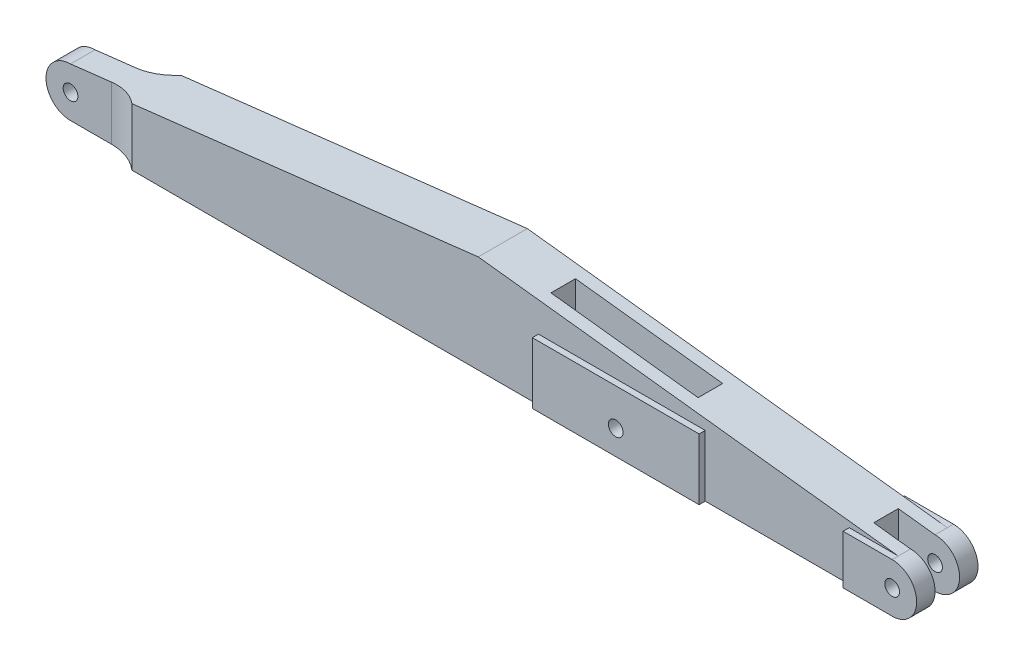
ISO-10303-21;
HEADER;
FILE_DESCRIPTION(('STEP AP214'),'2;1');
FILE_NAME('part.step','',(''),(''),'','','');
FILE_SCHEMA(('AUTOMOTIVE_DESIGN { 1 0 10303 214 1 1 1 1 }'));
ENDSEC;
DATA;
#1=APPLICATION_CONTEXT('core data for automotive mechanical design processes');
#2=APPLICATION_PROTOCOL_DEFINITION('international standard','automotive_design',2000,#1);
#3=PRODUCT_CONTEXT('',#1,'mechanical');
#4=PRODUCT('Part','Part','',(#3));
#5=PRODUCT_RELATED_PRODUCT_CATEGORY('part','',(#4));
#6=PRODUCT_DEFINITION_FORMATION('','',#4);
#7=PRODUCT_DEFINITION_CONTEXT('part definition',#1,'design');
#8=PRODUCT_DEFINITION('design','',#6,#7);
#9=PRODUCT_DEFINITION_SHAPE('','',#8);
#10=(LENGTH_UNIT() NAMED_UNIT(*) SI_UNIT(.MILLI.,.METRE.));
#11=(NAMED_UNIT(*) PLANE_ANGLE_UNIT() SI_UNIT($,.RADIAN.));
#12=(NAMED_UNIT(*) SI_UNIT($,.STERADIAN.) SOLID_ANGLE_UNIT());
#13=UNCERTAINTY_MEASURE_WITH_UNIT(LENGTH_MEASURE(1.E-05),#10,'distance_accuracy_value','');
#14=(GEOMETRIC_REPRESENTATION_CONTEXT(3) GLOBAL_UNCERTAINTY_ASSIGNED_CONTEXT((#13)) GLOBAL_UNIT_ASSIGNED_CONTEXT((#10,
#11,#12)) REPRESENTATION_CONTEXT('',''));
#15=CARTESIAN_POINT('',(0.,0.,0.));
#16=DIRECTION('',(0.,0.,1.));
#17=DIRECTION('',(1.,0.,0.));
#18=AXIS2_PLACEMENT_3D('',#15,#16,#17);
#19=CARTESIAN_POINT('',(114.8954508,0.,10.));
#20=DIRECTION('',(0.,0.,-1.));
#21=DIRECTION('',(-1.,0.,0.));
#22=AXIS2_PLACEMENT_3D('',#19,#20,#21);
#23=CYLINDRICAL_SURFACE('',#22,1.5);
#24=CARTESIAN_POINT('',(114.8954508,0.,2.5));
#25=DIRECTION('',(0.,0.,-1.));
#26=DIRECTION('',(-1.,0.,0.));
#27=AXIS2_PLACEMENT_3D('',#24,#25,#26);
#28=CIRCLE('',#27,1.5);
#29=CARTESIAN_POINT('',(113.3954508,0.,2.5));
#30=VERTEX_POINT('',#29);
#31=EDGE_CURVE('E285',#30,#30,#28,.T.);
#32=ORIENTED_EDGE('',*,*,#31,.F.);
#33=EDGE_LOOP('',(#32));
#34=FACE_BOUND('',#33,.T.);
#35=CARTESIAN_POINT('',(114.8954508,0.,-1.25));
#36=DIRECTION('',(0.,0.,1.));
#37=DIRECTION('',(1.,0.,0.));
#38=AXIS2_PLACEMENT_3D('',#35,#36,#37);
#39=CIRCLE('',#38,1.5);
#40=CARTESIAN_POINT('',(116.3954508,0.,-1.25));
#41=VERTEX_POINT('',#40);
#42=EDGE_CURVE('E437',#41,#41,#39,.T.);
#43=ORIENTED_EDGE('',*,*,#42,.F.);
#44=EDGE_LOOP('',(#43));
#45=FACE_BOUND('',#44,.T.);
#46=ADVANCED_FACE('F37',(#34,#45),#23,.F.);
#47=CARTESIAN_POINT('',(171.25,0.,10.));
#48=DIRECTION('',(0.,0.,-1.));
#49=DIRECTION('',(-1.,0.,0.));
#50=AXIS2_PLACEMENT_3D('',#47,#48,#49);
#51=CYLINDRICAL_SURFACE('',#50,5.);
#52=DIRECTION('',(0.,0.,-1.));
#53=VECTOR('',#52,1.);
#54=CARTESIAN_POINT('',(171.25,5.,10.));
#55=LINE('',#54,#53);
#56=CARTESIAN_POINT('',(171.25,5.,2.5));
#57=VERTEX_POINT('',#56);
#58=CARTESIAN_POINT('',(171.25,5.,0.));
#59=VERTEX_POINT('',#58);
#60=EDGE_CURVE('E337',#57,#59,#55,.T.);
#61=ORIENTED_EDGE('',*,*,#60,.F.);
#62=CARTESIAN_POINT('',(171.25,0.,2.5));
#63=DIRECTION('',(0.,0.,-1.));
#64=DIRECTION('',(-1.,0.,0.));
#65=AXIS2_PLACEMENT_3D('',#62,#63,#64);
#66=CIRCLE('',#65,5.);
#67=CARTESIAN_POINT('',(171.25,-5.,2.5));
#68=VERTEX_POINT('',#67);
#69=EDGE_CURVE('E435',#57,#68,#66,.T.);
#70=ORIENTED_EDGE('',*,*,#69,.T.);
#71=DIRECTION('',(0.,0.,-1.));
#72=VECTOR('',#71,1.);
#73=CARTESIAN_POINT('',(171.25,-5.,10.));
#74=LINE('',#73,#72);
#75=CARTESIAN_POINT('',(171.25,-5.,-1.25));
#76=VERTEX_POINT('',#75);
#77=EDGE_CURVE('E263',#68,#76,#74,.T.);
#78=ORIENTED_EDGE('',*,*,#77,.T.);
#79=CARTESIAN_POINT('',(171.25,0.,-1.25));
#80=DIRECTION('',(0.,0.,1.));
#81=DIRECTION('',(1.,0.,0.));
#82=AXIS2_PLACEMENT_3D('',#79,#80,#81);
#83=CIRCLE('',#82,5.);
#84=CARTESIAN_POINT('',(171.25,5.,-1.25));
#85=VERTEX_POINT('',#84);
#86=EDGE_CURVE('E369',#76,#85,#83,.T.);
#87=ORIENTED_EDGE('',*,*,#86,.T.);
#88=DIRECTION('',(0.,0.,-1.));
#89=VECTOR('',#88,1.);
#90=CARTESIAN_POINT('',(171.25,5.,11.25));
#91=LINE('',#90,#89);
#92=EDGE_CURVE('E359',#59,#85,#91,.T.);
#93=ORIENTED_EDGE('',*,*,#92,.F.);
#94=EDGE_LOOP('',(#61,#70,#78,#87,#93));
#95=FACE_BOUND('',#94,.T.);
#96=ADVANCED_FACE('F367',(#95),#51,.T.);
#97=CARTESIAN_POINT('',(171.25,0.,10.));
#98=DIRECTION('',(0.,0.,-1.));
#99=DIRECTION('',(-1.,0.,0.));
#100=AXIS2_PLACEMENT_3D('',#97,#98,#99);
#101=CYLINDRICAL_SURFACE('',#100,1.5);
#102=CARTESIAN_POINT('',(171.25,0.,2.5));
#103=DIRECTION('',(0.,0.,-1.));
#104=DIRECTION('',(-1.,0.,0.));
#105=AXIS2_PLACEMENT_3D('',#102,#103,#104);
#106=CIRCLE('',#105,1.5);
#107=CARTESIAN_POINT('',(169.75,0.,2.5));
#108=VERTEX_POINT('',#107);
#109=EDGE_CURVE('E272',#108,#108,#106,.T.);
#110=ORIENTED_EDGE('',*,*,#109,.F.);
#111=EDGE_LOOP('',(#110));
#112=FACE_BOUND('',#111,.T.);
#113=CARTESIAN_POINT('',(171.25,0.,-1.25));
#114=DIRECTION('',(0.,0.,1.));
#115=DIRECTION('',(1.,0.,0.));
#116=AXIS2_PLACEMENT_3D('',#113,#114,#115);
#117=CIRCLE('',#116,1.5);
#118=CARTESIAN_POINT('',(172.75,0.,-1.25));
#119=VERTEX_POINT('',#118);
#120=EDGE_CURVE('E491',#119,#119,#117,.T.);
#121=ORIENTED_EDGE('',*,*,#120,.F.);
#122=EDGE_LOOP('',(#121));
#123=FACE_BOUND('',#122,.T.);
#124=ADVANCED_FACE('F535',(#112,#123),#101,.F.);
#125=CARTESIAN_POINT('',(0.,0.,10.));
#126=DIRECTION('',(0.,0.,1.));
#127=DIRECTION('',(1.,0.,0.));
#128=AXIS2_PLACEMENT_3D('',#125,#126,#127);
#129=PLANE('',#128);
#130=DIRECTION('',(0.,1.,0.));
#131=VECTOR('',#130,1.);
#132=CARTESIAN_POINT('',(15.,0.,10.));
#133=LINE('',#132,#131);
#134=CARTESIAN_POINT('',(15.,-5.,10.));
#135=VERTEX_POINT('',#134);
#136=CARTESIAN_POINT('',(15.,6.75182481751825,10.));
#137=VERTEX_POINT('',#136);
#138=EDGE_CURVE('E389',#135,#137,#133,.T.);
#139=ORIENTED_EDGE('',*,*,#138,.F.);
#140=DIRECTION('',(1.,0.,0.));
#141=VECTOR('',#140,1.);
#142=CARTESIAN_POINT('',(0.,-5.,10.));
#143=LINE('',#142,#141);
#144=CARTESIAN_POINT('',(97.8954508,-5.,10.));
#145=VERTEX_POINT('',#144);
#146=EDGE_CURVE('E381',#135,#145,#143,.T.);
#147=ORIENTED_EDGE('',*,*,#146,.T.);
#148=DIRECTION('',(0.,1.,0.));
#149=VECTOR('',#148,1.);
#150=CARTESIAN_POINT('',(97.8954508,0.,10.));
#151=LINE('',#150,#149);
#152=CARTESIAN_POINT('',(97.8954508,7.5,10.));
#153=VERTEX_POINT('',#152);
#154=EDGE_CURVE('E481',#145,#153,#151,.T.);
#155=ORIENTED_EDGE('',*,*,#154,.T.);
#156=DIRECTION('',(1.,0.,0.));
#157=VECTOR('',#156,1.);
#158=CARTESIAN_POINT('',(0.,7.5,10.));
#159=LINE('',#158,#157);
#160=CARTESIAN_POINT('',(131.8954508,7.5,10.));
#161=VERTEX_POINT('',#160);
#162=EDGE_CURVE('E489',#153,#161,#159,.T.);
#163=ORIENTED_EDGE('',*,*,#162,.T.);
#164=DIRECTION('',(0.,-1.,0.));
#165=VECTOR('',#164,1.);
#166=CARTESIAN_POINT('',(131.8954508,0.,10.));
#167=LINE('',#166,#165);
#168=CARTESIAN_POINT('',(131.8954508,-5.,10.));
#169=VERTEX_POINT('',#168);
#170=EDGE_CURVE('E486',#161,#169,#167,.T.);
#171=ORIENTED_EDGE('',*,*,#170,.T.);
#172=CARTESIAN_POINT('',(161.25,-5.,10.));
#173=VERTEX_POINT('',#172);
#174=EDGE_CURVE('E334',#169,#173,#143,.T.);
#175=ORIENTED_EDGE('',*,*,#174,.T.);
#176=DIRECTION('',(0.,1.,0.));
#177=VECTOR('',#176,1.);
#178=CARTESIAN_POINT('',(161.25,0.,10.));
#179=LINE('',#178,#177);
#180=CARTESIAN_POINT('',(161.25,5.,10.));
#181=VERTEX_POINT('',#180);
#182=EDGE_CURVE('E328',#173,#181,#179,.T.);
#183=ORIENTED_EDGE('',*,*,#182,.T.);
#184=DIRECTION('',(1.,0.,0.));
#185=VECTOR('',#184,1.);
#186=CARTESIAN_POINT('',(0.,5.00000000000002,10.));
#187=LINE('',#186,#185);
#188=CARTESIAN_POINT('',(171.25,5.,10.));
#189=VERTEX_POINT('',#188);
#190=EDGE_CURVE('E363',#181,#189,#187,.T.);
#191=ORIENTED_EDGE('',*,*,#190,.T.);
#192=DIRECTION('',(-0.993249224024347,0.115999909375106,0.));
#193=VECTOR('',#192,1.);
#194=CARTESIAN_POINT('',(85.625,15.,10.));
#195=LINE('',#194,#193);
#196=CARTESIAN_POINT('',(85.625,15.,10.));
#197=VERTEX_POINT('',#196);
#198=EDGE_CURVE('E382',#189,#197,#195,.T.);
#199=ORIENTED_EDGE('',*,*,#198,.T.);
#200=DIRECTION('',(-0.993249224024347,-0.115999909375106,0.));
#201=VECTOR('',#200,1.);
#202=CARTESIAN_POINT('',(0.,5.,10.));
#203=LINE('',#202,#201);
#204=EDGE_CURVE('E330',#197,#137,#203,.T.);
#205=ORIENTED_EDGE('',*,*,#204,.T.);
#206=EDGE_LOOP('',(#139,#147,#155,#163,#171,#175,#183,#191,#199,#205));
#207=FACE_BOUND('',#206,.T.);
#208=ADVANCED_FACE('F388',(#207),#129,.T.);
#209=CARTESIAN_POINT('',(0.,0.,0.));
#210=DIRECTION('',(0.,0.,1.));
#211=DIRECTION('',(1.,0.,0.));
#212=AXIS2_PLACEMENT_3D('',#209,#210,#211);
#213=PLANE('',#212);
#214=DIRECTION('',(1.,0.,0.));
#215=VECTOR('',#214,1.);
#216=CARTESIAN_POINT('',(0.,-5.,0.));
#217=LINE('',#216,#215);
#218=CARTESIAN_POINT('',(15.,-5.,0.));
#219=VERTEX_POINT('',#218);
#220=CARTESIAN_POINT('',(97.8954508,-5.,0.));
#221=VERTEX_POINT('',#220);
#222=EDGE_CURVE('E317',#219,#221,#217,.T.);
#223=ORIENTED_EDGE('',*,*,#222,.F.);
#224=DIRECTION('',(0.,1.,0.));
#225=VECTOR('',#224,1.);
#226=CARTESIAN_POINT('',(15.,0.,0.));
#227=LINE('',#226,#225);
#228=CARTESIAN_POINT('',(15.,6.75182481751825,0.));
#229=VERTEX_POINT('',#228);
#230=EDGE_CURVE('E252',#219,#229,#227,.T.);
#231=ORIENTED_EDGE('',*,*,#230,.T.);
#232=DIRECTION('',(-0.993249224024347,-0.115999909375106,0.));
#233=VECTOR('',#232,1.);
#234=CARTESIAN_POINT('',(0.,5.,0.));
#235=LINE('',#234,#233);
#236=CARTESIAN_POINT('',(85.625,15.,0.));
#237=VERTEX_POINT('',#236);
#238=EDGE_CURVE('E311',#237,#229,#235,.T.);
#239=ORIENTED_EDGE('',*,*,#238,.F.);
#240=DIRECTION('',(-0.993249224024347,0.115999909375106,0.));
#241=VECTOR('',#240,1.);
#242=CARTESIAN_POINT('',(85.625,15.,0.));
#243=LINE('',#242,#241);
#244=EDGE_CURVE('E324',#59,#237,#243,.T.);
#245=ORIENTED_EDGE('',*,*,#244,.F.);
#246=DIRECTION('',(1.,0.,0.));
#247=VECTOR('',#246,1.);
#248=CARTESIAN_POINT('',(0.,5.00000000000002,0.));
#249=LINE('',#248,#247);
#250=CARTESIAN_POINT('',(161.25,5.,0.));
#251=VERTEX_POINT('',#250);
#252=EDGE_CURVE('E356',#251,#59,#249,.T.);
#253=ORIENTED_EDGE('',*,*,#252,.F.);
#254=DIRECTION('',(0.,1.,0.));
#255=VECTOR('',#254,1.);
#256=CARTESIAN_POINT('',(161.25,0.,0.));
#257=LINE('',#256,#255);
#258=CARTESIAN_POINT('',(161.25,-5.,0.));
#259=VERTEX_POINT('',#258);
#260=EDGE_CURVE('E378',#259,#251,#257,.T.);
#261=ORIENTED_EDGE('',*,*,#260,.F.);
#262=CARTESIAN_POINT('',(131.8954508,-5.,0.));
#263=VERTEX_POINT('',#262);
#264=EDGE_CURVE('E325',#263,#259,#217,.T.);
#265=ORIENTED_EDGE('',*,*,#264,.F.);
#266=DIRECTION('',(0.,-1.,0.));
#267=VECTOR('',#266,1.);
#268=CARTESIAN_POINT('',(131.8954508,0.,0.));
#269=LINE('',#268,#267);
#270=CARTESIAN_POINT('',(131.8954508,7.5,0.));
#271=VERTEX_POINT('',#270);
#272=EDGE_CURVE('E483',#271,#263,#269,.T.);
#273=ORIENTED_EDGE('',*,*,#272,.F.);
#274=DIRECTION('',(1.,0.,0.));
#275=VECTOR('',#274,1.);
#276=CARTESIAN_POINT('',(0.,7.5,0.));
#277=LINE('',#276,#275);
#278=CARTESIAN_POINT('',(97.8954508,7.5,0.));
#279=VERTEX_POINT('',#278);
#280=EDGE_CURVE('E257',#279,#271,#277,.T.);
#281=ORIENTED_EDGE('',*,*,#280,.F.);
#282=DIRECTION('',(0.,1.,0.));
#283=VECTOR('',#282,1.);
#284=CARTESIAN_POINT('',(97.8954508,0.,0.));
#285=LINE('',#284,#283);
#286=EDGE_CURVE('E323',#221,#279,#285,.T.);
#287=ORIENTED_EDGE('',*,*,#286,.F.);
#288=EDGE_LOOP('',(#223,#231,#239,#245,#253,#261,#265,#273,#281,#287));
#289=FACE_BOUND('',#288,.T.);
#290=ADVANCED_FACE('F321',(#289),#213,.F.);
#291=CARTESIAN_POINT('',(0.,0.,10.));
#292=DIRECTION('',(0.,0.,-1.));
#293=DIRECTION('',(-1.,0.,0.));
#294=AXIS2_PLACEMENT_3D('',#291,#292,#293);
#295=CYLINDRICAL_SURFACE('',#294,5.);
#296=DIRECTION('',(0.,0.,-1.));
#297=VECTOR('',#296,1.);
#298=CARTESIAN_POINT('',(0.,5.,10.));
#299=LINE('',#298,#297);
#300=CARTESIAN_POINT('',(0.,5.,7.5));
#301=VERTEX_POINT('',#300);
#302=CARTESIAN_POINT('',(0.,5.,2.5));
#303=VERTEX_POINT('',#302);
#304=EDGE_CURVE('E251',#301,#303,#299,.T.);
#305=ORIENTED_EDGE('',*,*,#304,.T.);
#306=CARTESIAN_POINT('',(0.,0.,2.5));
#307=DIRECTION('',(0.,0.,1.));
#308=DIRECTION('',(1.,0.,0.));
#309=AXIS2_PLACEMENT_3D('',#306,#307,#308);
#310=CIRCLE('',#309,5.);
#311=CARTESIAN_POINT('',(0.,-5.,2.5));
#312=VERTEX_POINT('',#311);
#313=EDGE_CURVE('E238',#303,#312,#310,.T.);
#314=ORIENTED_EDGE('',*,*,#313,.T.);
#315=DIRECTION('',(0.,0.,-1.));
#316=VECTOR('',#315,1.);
#317=CARTESIAN_POINT('',(0.,-5.,10.));
#318=LINE('',#317,#316);
#319=CARTESIAN_POINT('',(0.,-5.,7.5));
#320=VERTEX_POINT('',#319);
#321=EDGE_CURVE('E249',#320,#312,#318,.T.);
#322=ORIENTED_EDGE('',*,*,#321,.F.);
#323=CARTESIAN_POINT('',(0.,0.,7.5));
#324=DIRECTION('',(0.,0.,-1.));
#325=DIRECTION('',(-1.,0.,0.));
#326=AXIS2_PLACEMENT_3D('',#323,#324,#325);
#327=CIRCLE('',#326,5.);
#328=EDGE_CURVE('E393',#320,#301,#327,.T.);
#329=ORIENTED_EDGE('',*,*,#328,.T.);
#330=EDGE_LOOP('',(#305,#314,#322,#329));
#331=FACE_BOUND('',#330,.T.);
#332=ADVANCED_FACE('F247',(#331),#295,.T.);
#333=CARTESIAN_POINT('',(0.,-5.,10.));
#334=DIRECTION('',(0.,1.,0.));
#335=DIRECTION('',(0.,0.,1.));
#336=AXIS2_PLACEMENT_3D('',#333,#334,#335);
#337=PLANE('',#336);
#338=DIRECTION('',(-1.,0.,0.));
#339=VECTOR('',#338,1.);
#340=CARTESIAN_POINT('',(97.94374,-5.,7.5));
#341=LINE('',#340,#339);
#342=CARTESIAN_POINT('',(127.94374,-5.,7.5));
#343=VERTEX_POINT('',#342);
#344=CARTESIAN_POINT('',(97.94374,-5.,7.5));
#345=VERTEX_POINT('',#344);
#346=EDGE_CURVE('E395',#343,#345,#341,.T.);
#347=ORIENTED_EDGE('',*,*,#346,.F.);
#348=DIRECTION('',(0.,0.,1.));
#349=VECTOR('',#348,1.);
#350=CARTESIAN_POINT('',(127.94374,-5.,2.5));
#351=LINE('',#350,#349);
#352=CARTESIAN_POINT('',(127.94374,-5.,2.5));
#353=VERTEX_POINT('',#352);
#354=EDGE_CURVE('E392',#353,#343,#351,.T.);
#355=ORIENTED_EDGE('',*,*,#354,.F.);
#356=DIRECTION('',(1.,0.,0.));
#357=VECTOR('',#356,1.);
#358=CARTESIAN_POINT('',(97.94374,-5.,2.5));
#359=LINE('',#358,#357);
#360=CARTESIAN_POINT('',(97.94374,-5.,2.5));
#361=VERTEX_POINT('',#360);
#362=EDGE_CURVE('E405',#361,#353,#359,.T.);
#363=ORIENTED_EDGE('',*,*,#362,.F.);
#364=DIRECTION('',(0.,0.,-1.));
#365=VECTOR('',#364,1.);
#366=CARTESIAN_POINT('',(97.94374,-5.,2.5));
#367=LINE('',#366,#365);
#368=EDGE_CURVE('E402',#345,#361,#367,.T.);
#369=ORIENTED_EDGE('',*,*,#368,.F.);
#370=EDGE_LOOP('',(#347,#355,#363,#369));
#371=FACE_BOUND('',#370,.T.);
#372=ORIENTED_EDGE('',*,*,#321,.T.);
#373=DIRECTION('',(-1.,0.,0.));
#374=VECTOR('',#373,1.);
#375=CARTESIAN_POINT('',(-25.,-5.,2.5));
#376=LINE('',#375,#374);
#377=CARTESIAN_POINT('',(8.38562172233853,-5.,2.5));
#378=VERTEX_POINT('',#377);
#379=EDGE_CURVE('E234',#378,#312,#376,.T.);
#380=ORIENTED_EDGE('',*,*,#379,.F.);
#381=CARTESIAN_POINT('',(8.38562172233853,-5.,-7.5));
#382=DIRECTION('',(0.,1.,0.));
#383=DIRECTION('',(0.,0.,1.));
#384=AXIS2_PLACEMENT_3D('',#381,#382,#383);
#385=CIRCLE('',#384,10.);
#386=EDGE_CURVE('E302',#378,#219,#385,.T.);
#387=ORIENTED_EDGE('',*,*,#386,.T.);
#388=ORIENTED_EDGE('',*,*,#222,.T.);
#389=DIRECTION('',(0.,0.,-1.));
#390=VECTOR('',#389,1.);
#391=CARTESIAN_POINT('',(97.8954508,-5.,11.25));
#392=LINE('',#391,#390);
#393=CARTESIAN_POINT('',(97.8954508,-5.,-1.25));
#394=VERTEX_POINT('',#393);
#395=EDGE_CURVE('E468',#221,#394,#392,.T.);
#396=ORIENTED_EDGE('',*,*,#395,.T.);
#397=DIRECTION('',(1.,0.,0.));
#398=VECTOR('',#397,1.);
#399=CARTESIAN_POINT('',(97.8954508,-5.,-1.25));
#400=LINE('',#399,#398);
#401=CARTESIAN_POINT('',(131.8954508,-5.,-1.25));
#402=VERTEX_POINT('',#401);
#403=EDGE_CURVE('E448',#394,#402,#400,.T.);
#404=ORIENTED_EDGE('',*,*,#403,.T.);
#405=DIRECTION('',(0.,0.,-1.));
#406=VECTOR('',#405,1.);
#407=CARTESIAN_POINT('',(131.8954508,-5.,11.25));
#408=LINE('',#407,#406);
#409=EDGE_CURVE('E454',#263,#402,#408,.T.);
#410=ORIENTED_EDGE('',*,*,#409,.F.);
#411=ORIENTED_EDGE('',*,*,#264,.T.);
#412=DIRECTION('',(0.,0.,-1.));
#413=VECTOR('',#412,1.);
#414=CARTESIAN_POINT('',(161.25,-5.,11.25));
#415=LINE('',#414,#413);
#416=CARTESIAN_POINT('',(161.25,-5.,-1.25));
#417=VERTEX_POINT('',#416);
#418=EDGE_CURVE('E508',#259,#417,#415,.T.);
#419=ORIENTED_EDGE('',*,*,#418,.T.);
#420=DIRECTION('',(1.,0.,0.));
#421=VECTOR('',#420,1.);
#422=CARTESIAN_POINT('',(171.25,-5.,-1.25));
#423=LINE('',#422,#421);
#424=EDGE_CURVE('E501',#417,#76,#423,.T.);
#425=ORIENTED_EDGE('',*,*,#424,.T.);
#426=ORIENTED_EDGE('',*,*,#77,.F.);
#427=DIRECTION('',(1.,0.,0.));
#428=VECTOR('',#427,1.);
#429=CARTESIAN_POINT('',(163.75,-5.,2.5));
#430=LINE('',#429,#428);
#431=CARTESIAN_POINT('',(163.75,-5.,2.5));
#432=VERTEX_POINT('',#431);
#433=EDGE_CURVE('E426',#432,#68,#430,.T.);
#434=ORIENTED_EDGE('',*,*,#433,.F.);
#435=DIRECTION('',(0.,0.,-1.));
#436=VECTOR('',#435,1.);
#437=CARTESIAN_POINT('',(163.75,-5.,2.5));
#438=LINE('',#437,#436);
#439=CARTESIAN_POINT('',(163.75,-5.,7.5));
#440=VERTEX_POINT('',#439);
#441=EDGE_CURVE('E423',#440,#432,#438,.T.);
#442=ORIENTED_EDGE('',*,*,#441,.F.);
#443=DIRECTION('',(-1.,0.,0.));
#444=VECTOR('',#443,1.);
#445=CARTESIAN_POINT('',(163.75,-5.,7.5));
#446=LINE('',#445,#444);
#447=CARTESIAN_POINT('',(171.25,-5.,7.5));
#448=VERTEX_POINT('',#447);
#449=EDGE_CURVE('E420',#448,#440,#446,.T.);
#450=ORIENTED_EDGE('',*,*,#449,.F.);
#451=CARTESIAN_POINT('',(171.25,-5.,11.25));
#452=VERTEX_POINT('',#451);
#453=EDGE_CURVE('E258',#452,#448,#74,.T.);
#454=ORIENTED_EDGE('',*,*,#453,.F.);
#455=DIRECTION('',(1.,0.,0.));
#456=VECTOR('',#455,1.);
#457=CARTESIAN_POINT('',(171.25,-5.,11.25));
#458=LINE('',#457,#456);
#459=CARTESIAN_POINT('',(161.25,-5.,11.25));
#460=VERTEX_POINT('',#459);
#461=EDGE_CURVE('E505',#460,#452,#458,.T.);
#462=ORIENTED_EDGE('',*,*,#461,.F.);
#463=EDGE_CURVE('E516',#460,#173,#415,.T.);
#464=ORIENTED_EDGE('',*,*,#463,.T.);
#465=ORIENTED_EDGE('',*,*,#174,.F.);
#466=CARTESIAN_POINT('',(131.8954508,-5.,11.25));
#467=VERTEX_POINT('',#466);
#468=EDGE_CURVE('E465',#467,#169,#408,.T.);
#469=ORIENTED_EDGE('',*,*,#468,.F.);
#470=DIRECTION('',(1.,0.,0.));
#471=VECTOR('',#470,1.);
#472=CARTESIAN_POINT('',(97.8954508,-5.,11.25));
#473=LINE('',#472,#471);
#474=CARTESIAN_POINT('',(97.8954508,-5.,11.25));
#475=VERTEX_POINT('',#474);
#476=EDGE_CURVE('E452',#475,#467,#473,.T.);
#477=ORIENTED_EDGE('',*,*,#476,.F.);
#478=EDGE_CURVE('E469',#475,#145,#392,.T.);
#479=ORIENTED_EDGE('',*,*,#478,.T.);
#480=ORIENTED_EDGE('',*,*,#146,.F.);
#481=CARTESIAN_POINT('',(8.38562172233853,-5.,17.5));
#482=DIRECTION('',(0.,1.,0.));
#483=DIRECTION('',(0.,0.,1.));
#484=AXIS2_PLACEMENT_3D('',#481,#482,#483);
#485=CIRCLE('',#484,10.);
#486=CARTESIAN_POINT('',(8.38562172233853,-5.,7.5));
#487=VERTEX_POINT('',#486);
#488=EDGE_CURVE('E45',#135,#487,#485,.T.);
#489=ORIENTED_EDGE('',*,*,#488,.T.);
#490=DIRECTION('',(1.,0.,0.));
#491=VECTOR('',#490,1.);
#492=CARTESIAN_POINT('',(-25.,-5.,7.5));
#493=LINE('',#492,#491);
#494=EDGE_CURVE('E256',#320,#487,#493,.T.);
#495=ORIENTED_EDGE('',*,*,#494,.F.);
#496=EDGE_LOOP('',(#372,#380,#387,#388,#396,#404,#410,#411,#419,#425,#426,#434,#442,#450,#454,
#462,#464,#465,#469,#477,#479,#480,#489,#495));
#497=FACE_BOUND('',#496,.T.);
#498=ADVANCED_FACE('F255',(#371,#497),#337,.F.);
#499=ORIENTED_EDGE('',*,*,#453,.T.);
#500=CARTESIAN_POINT('',(171.25,0.,7.5));
#501=DIRECTION('',(0.,0.,1.));
#502=DIRECTION('',(1.,0.,0.));
#503=AXIS2_PLACEMENT_3D('',#500,#501,#502);
#504=CIRCLE('',#503,5.);
#505=CARTESIAN_POINT('',(171.25,5.,7.5));
#506=VERTEX_POINT('',#505);
#507=EDGE_CURVE('E276',#448,#506,#504,.T.);
#508=ORIENTED_EDGE('',*,*,#507,.T.);
#509=EDGE_CURVE('E338',#189,#506,#55,.T.);
#510=ORIENTED_EDGE('',*,*,#509,.F.);
#511=CARTESIAN_POINT('',(171.25,5.,11.25));
#512=VERTEX_POINT('',#511);
#513=EDGE_CURVE('E364',#512,#189,#91,.T.);
#514=ORIENTED_EDGE('',*,*,#513,.F.);
#515=CARTESIAN_POINT('',(171.25,0.,11.25));
#516=DIRECTION('',(0.,0.,1.));
#517=DIRECTION('',(1.,0.,0.));
#518=AXIS2_PLACEMENT_3D('',#515,#516,#517);
#519=CIRCLE('',#518,5.);
#520=EDGE_CURVE('E497',#452,#512,#519,.T.);
#521=ORIENTED_EDGE('',*,*,#520,.F.);
#522=EDGE_LOOP('',(#499,#508,#510,#514,#521));
#523=FACE_BOUND('',#522,.T.);
#524=ADVANCED_FACE('F545',(#523),#51,.T.);
#525=CARTESIAN_POINT('',(85.625,15.,10.));
#526=DIRECTION('',(-0.115999909375106,-0.993249224024347,0.));
#527=DIRECTION('',(0.993249224024347,-0.115999909375106,0.));
#528=AXIS2_PLACEMENT_3D('',#525,#526,#527);
#529=PLANE('',#528);
#530=DIRECTION('',(0.993249224024347,-0.115999909375106,0.));
#531=VECTOR('',#530,1.);
#532=CARTESIAN_POINT('',(85.625,15.,2.5));
#533=LINE('',#532,#531);
#534=CARTESIAN_POINT('',(97.94374,13.5613150364963,2.5));
#535=VERTEX_POINT('',#534);
#536=CARTESIAN_POINT('',(127.94374,10.0576654014599,2.5));
#537=VERTEX_POINT('',#536);
#538=EDGE_CURVE('E288',#535,#537,#533,.T.);
#539=ORIENTED_EDGE('',*,*,#538,.T.);
#540=DIRECTION('',(0.,0.,1.));
#541=VECTOR('',#540,1.);
#542=CARTESIAN_POINT('',(127.94374,10.0576654014599,10.));
#543=LINE('',#542,#541);
#544=CARTESIAN_POINT('',(127.94374,10.0576654014599,7.5));
#545=VERTEX_POINT('',#544);
#546=EDGE_CURVE('E291',#537,#545,#543,.T.);
#547=ORIENTED_EDGE('',*,*,#546,.T.);
#548=DIRECTION('',(-0.993249224024347,0.115999909375106,0.));
#549=VECTOR('',#548,1.);
#550=CARTESIAN_POINT('',(85.625,15.,7.5));
#551=LINE('',#550,#549);
#552=CARTESIAN_POINT('',(97.94374,13.5613150364963,7.5));
#553=VERTEX_POINT('',#552);
#554=EDGE_CURVE('E283',#545,#553,#551,.T.);
#555=ORIENTED_EDGE('',*,*,#554,.T.);
#556=DIRECTION('',(0.,0.,-1.));
#557=VECTOR('',#556,1.);
#558=CARTESIAN_POINT('',(97.94374,13.5613150364963,10.));
#559=LINE('',#558,#557);
#560=EDGE_CURVE('E279',#553,#535,#559,.T.);
#561=ORIENTED_EDGE('',*,*,#560,.T.);
#562=EDGE_LOOP('',(#539,#547,#555,#561));
#563=FACE_BOUND('',#562,.T.);
#564=DIRECTION('',(0.,0.,-1.));
#565=VECTOR('',#564,1.);
#566=CARTESIAN_POINT('',(163.75,5.87591240875912,10.));
#567=LINE('',#566,#565);
#568=CARTESIAN_POINT('',(163.75,5.87591240875912,7.5));
#569=VERTEX_POINT('',#568);
#570=CARTESIAN_POINT('',(163.75,5.87591240875912,2.5));
#571=VERTEX_POINT('',#570);
#572=EDGE_CURVE('E260',#569,#571,#567,.T.);
#573=ORIENTED_EDGE('',*,*,#572,.T.);
#574=DIRECTION('',(0.993249224024347,-0.115999909375106,0.));
#575=VECTOR('',#574,1.);
#576=CARTESIAN_POINT('',(85.625,15.,2.5));
#577=LINE('',#576,#575);
#578=EDGE_CURVE('E275',#571,#57,#577,.T.);
#579=ORIENTED_EDGE('',*,*,#578,.T.);
#580=ORIENTED_EDGE('',*,*,#60,.T.);
#581=ORIENTED_EDGE('',*,*,#244,.T.);
#582=DIRECTION('',(0.,0.,-1.));
#583=VECTOR('',#582,1.);
#584=CARTESIAN_POINT('',(85.625,15.,10.));
#585=LINE('',#584,#583);
#586=EDGE_CURVE('E336',#197,#237,#585,.T.);
#587=ORIENTED_EDGE('',*,*,#586,.F.);
#588=ORIENTED_EDGE('',*,*,#198,.F.);
#589=ORIENTED_EDGE('',*,*,#509,.T.);
#590=DIRECTION('',(-0.993249224024347,0.115999909375106,0.));
#591=VECTOR('',#590,1.);
#592=CARTESIAN_POINT('',(85.625,15.,7.5));
#593=LINE('',#592,#591);
#594=EDGE_CURVE('E270',#506,#569,#593,.T.);
#595=ORIENTED_EDGE('',*,*,#594,.T.);
#596=EDGE_LOOP('',(#573,#579,#580,#581,#587,#588,#589,#595));
#597=FACE_BOUND('',#596,.T.);
#598=ADVANCED_FACE('F347',(#563,#597),#529,.F.);
#599=CARTESIAN_POINT('',(0.,5.,10.));
#600=DIRECTION('',(0.115999909375106,-0.993249224024347,0.));
#601=DIRECTION('',(0.993249224024347,0.115999909375106,0.));
#602=AXIS2_PLACEMENT_3D('',#599,#600,#601);
#603=PLANE('',#602);
#604=ORIENTED_EDGE('',*,*,#238,.T.);
#605=CARTESIAN_POINT('',(8.38562172233853,5.97934268290085,-7.5));
#606=DIRECTION('',(0.115999909375106,-0.993249224024347,0.));
#607=DIRECTION('',(-0.993249224024347,-0.115999909375106,0.));
#608=AXIS2_PLACEMENT_3D('',#605,#606,#607);
#609=ELLIPSE('',#608,10.0679665869589,10.);
#610=CARTESIAN_POINT('',(8.38562172233853,5.97934268290085,2.5));
#611=VERTEX_POINT('',#610);
#612=EDGE_CURVE('E304',#229,#611,#609,.T.);
#613=ORIENTED_EDGE('',*,*,#612,.T.);
#614=DIRECTION('',(-0.993249224024347,-0.115999909375106,0.));
#615=VECTOR('',#614,1.);
#616=CARTESIAN_POINT('',(0.,5.,2.5));
#617=LINE('',#616,#615);
#618=EDGE_CURVE('E253',#611,#303,#617,.T.);
#619=ORIENTED_EDGE('',*,*,#618,.T.);
#620=ORIENTED_EDGE('',*,*,#304,.F.);
#621=DIRECTION('',(0.993249224024347,0.115999909375106,0.));
#622=VECTOR('',#621,1.);
#623=CARTESIAN_POINT('',(0.,5.,7.5));
#624=LINE('',#623,#622);
#625=CARTESIAN_POINT('',(8.38562172233853,5.97934268290085,7.5));
#626=VERTEX_POINT('',#625);
#627=EDGE_CURVE('E297',#301,#626,#624,.T.);
#628=ORIENTED_EDGE('',*,*,#627,.T.);
#629=CARTESIAN_POINT('',(8.38562172233853,5.97934268290085,17.5));
#630=DIRECTION('',(0.115999909375106,-0.993249224024347,0.));
#631=DIRECTION('',(-0.993249224024347,-0.115999909375106,0.));
#632=AXIS2_PLACEMENT_3D('',#629,#630,#631);
#633=ELLIPSE('',#632,10.0679665869589,10.);
#634=EDGE_CURVE('E11',#626,#137,#633,.T.);
#635=ORIENTED_EDGE('',*,*,#634,.T.);
#636=ORIENTED_EDGE('',*,*,#204,.F.);
#637=ORIENTED_EDGE('',*,*,#586,.T.);
#638=EDGE_LOOP('',(#604,#613,#619,#620,#628,#635,#636,#637));
#639=FACE_BOUND('',#638,.T.);
#640=ADVANCED_FACE('F308',(#639),#603,.F.);
#641=CARTESIAN_POINT('',(0.,0.,10.));
#642=DIRECTION('',(0.,0.,-1.));
#643=DIRECTION('',(-1.,0.,0.));
#644=AXIS2_PLACEMENT_3D('',#641,#642,#643);
#645=CYLINDRICAL_SURFACE('',#644,1.5);
#646=CARTESIAN_POINT('',(0.,0.,2.5));
#647=DIRECTION('',(0.,0.,1.));
#648=DIRECTION('',(1.,0.,0.));
#649=AXIS2_PLACEMENT_3D('',#646,#647,#648);
#650=CIRCLE('',#649,1.5);
#651=CARTESIAN_POINT('',(1.5,0.,2.5));
#652=VERTEX_POINT('',#651);
#653=EDGE_CURVE('E243',#652,#652,#650,.T.);
#654=ORIENTED_EDGE('',*,*,#653,.F.);
#655=EDGE_LOOP('',(#654));
#656=FACE_BOUND('',#655,.T.);
#657=CARTESIAN_POINT('',(0.,0.,7.5));
#658=DIRECTION('',(0.,0.,-1.));
#659=DIRECTION('',(-1.,0.,0.));
#660=AXIS2_PLACEMENT_3D('',#657,#658,#659);
#661=CIRCLE('',#660,1.5);
#662=CARTESIAN_POINT('',(-1.5,0.,7.5));
#663=VERTEX_POINT('',#662);
#664=EDGE_CURVE('E294',#663,#663,#661,.T.);
#665=ORIENTED_EDGE('',*,*,#664,.F.);
#666=EDGE_LOOP('',(#665));
#667=FACE_BOUND('',#666,.T.);
#668=ADVANCED_FACE('F653',(#656,#667),#645,.F.);
#669=CARTESIAN_POINT('',(161.25,5.,11.25));
#670=DIRECTION('',(1.,0.,0.));
#671=DIRECTION('',(0.,0.,-1.));
#672=AXIS2_PLACEMENT_3D('',#669,#670,#671);
#673=PLANE('',#672);
#674=ORIENTED_EDGE('',*,*,#418,.F.);
#675=ORIENTED_EDGE('',*,*,#260,.T.);
#676=DIRECTION('',(0.,0.,-1.));
#677=VECTOR('',#676,1.);
#678=CARTESIAN_POINT('',(161.25,5.,11.25));
#679=LINE('',#678,#677);
#680=CARTESIAN_POINT('',(161.25,5.,-1.25));
#681=VERTEX_POINT('',#680);
#682=EDGE_CURVE('E361',#251,#681,#679,.T.);
#683=ORIENTED_EDGE('',*,*,#682,.T.);
#684=DIRECTION('',(0.,-1.,0.));
#685=VECTOR('',#684,1.);
#686=CARTESIAN_POINT('',(161.25,5.,-1.25));
#687=LINE('',#686,#685);
#688=EDGE_CURVE('E512',#681,#417,#687,.T.);
#689=ORIENTED_EDGE('',*,*,#688,.T.);
#690=EDGE_LOOP('',(#674,#675,#683,#689));
#691=FACE_BOUND('',#690,.T.);
#692=ADVANCED_FACE('F526',(#691),#673,.F.);
#693=CARTESIAN_POINT('',(171.25,5.,11.25));
#694=DIRECTION('',(0.,-1.,0.));
#695=DIRECTION('',(1.,0.,0.));
#696=AXIS2_PLACEMENT_3D('',#693,#694,#695);
#697=PLANE('',#696);
#698=ORIENTED_EDGE('',*,*,#682,.F.);
#699=ORIENTED_EDGE('',*,*,#252,.T.);
#700=ORIENTED_EDGE('',*,*,#92,.T.);
#701=DIRECTION('',(-1.,0.,0.));
#702=VECTOR('',#701,1.);
#703=CARTESIAN_POINT('',(171.25,5.,-1.25));
#704=LINE('',#703,#702);
#705=EDGE_CURVE('E510',#85,#681,#704,.T.);
#706=ORIENTED_EDGE('',*,*,#705,.T.);
#707=EDGE_LOOP('',(#698,#699,#700,#706));
#708=FACE_BOUND('',#707,.T.);
#709=ADVANCED_FACE('F357',(#708),#697,.F.);
#710=CARTESIAN_POINT('',(171.25,0.,-1.25));
#711=DIRECTION('',(0.,0.,1.));
#712=DIRECTION('',(1.,0.,0.));
#713=AXIS2_PLACEMENT_3D('',#710,#711,#712);
#714=PLANE('',#713);
#715=ORIENTED_EDGE('',*,*,#86,.F.);
#716=ORIENTED_EDGE('',*,*,#424,.F.);
#717=ORIENTED_EDGE('',*,*,#688,.F.);
#718=ORIENTED_EDGE('',*,*,#705,.F.);
#719=EDGE_LOOP('',(#715,#716,#717,#718));
#720=FACE_BOUND('',#719,.T.);
#721=ORIENTED_EDGE('',*,*,#120,.T.);
#722=EDGE_LOOP('',(#721));
#723=FACE_BOUND('',#722,.T.);
#724=ADVANCED_FACE('F528',(#720,#723),#714,.F.);
#725=CARTESIAN_POINT('',(171.25,0.,7.5));
#726=DIRECTION('',(0.,0.,1.));
#727=DIRECTION('',(1.,0.,0.));
#728=AXIS2_PLACEMENT_3D('',#725,#726,#727);
#729=CIRCLE('',#728,1.5);
#730=CARTESIAN_POINT('',(172.75,0.,7.5));
#731=VERTEX_POINT('',#730);
#732=EDGE_CURVE('E267',#731,#731,#729,.T.);
#733=ORIENTED_EDGE('',*,*,#732,.F.);
#734=EDGE_LOOP('',(#733));
#735=FACE_BOUND('',#734,.T.);
#736=CARTESIAN_POINT('',(171.25,0.,11.25));
#737=DIRECTION('',(0.,0.,1.));
#738=DIRECTION('',(1.,0.,0.));
#739=AXIS2_PLACEMENT_3D('',#736,#737,#738);
#740=CIRCLE('',#739,1.5);
#741=CARTESIAN_POINT('',(172.75,0.,11.25));
#742=VERTEX_POINT('',#741);
#743=EDGE_CURVE('E492',#742,#742,#740,.T.);
#744=ORIENTED_EDGE('',*,*,#743,.T.);
#745=EDGE_LOOP('',(#744));
#746=FACE_BOUND('',#745,.T.);
#747=ADVANCED_FACE('F531',(#735,#746),#101,.F.);
#748=CARTESIAN_POINT('',(171.25,0.,11.25));
#749=DIRECTION('',(0.,0.,1.));
#750=DIRECTION('',(1.,0.,0.));
#751=AXIS2_PLACEMENT_3D('',#748,#749,#750);
#752=PLANE('',#751);
#753=ORIENTED_EDGE('',*,*,#520,.T.);
#754=DIRECTION('',(-1.,0.,0.));
#755=VECTOR('',#754,1.);
#756=CARTESIAN_POINT('',(171.25,5.,11.25));
#757=LINE('',#756,#755);
#758=CARTESIAN_POINT('',(161.25,5.,11.25));
#759=VERTEX_POINT('',#758);
#760=EDGE_CURVE('E500',#512,#759,#757,.T.);
#761=ORIENTED_EDGE('',*,*,#760,.T.);
#762=DIRECTION('',(0.,-1.,0.));
#763=VECTOR('',#762,1.);
#764=CARTESIAN_POINT('',(161.25,5.,11.25));
#765=LINE('',#764,#763);
#766=EDGE_CURVE('E503',#759,#460,#765,.T.);
#767=ORIENTED_EDGE('',*,*,#766,.T.);
#768=ORIENTED_EDGE('',*,*,#461,.T.);
#769=EDGE_LOOP('',(#753,#761,#767,#768));
#770=FACE_BOUND('',#769,.T.);
#771=ORIENTED_EDGE('',*,*,#743,.F.);
#772=EDGE_LOOP('',(#771));
#773=FACE_BOUND('',#772,.T.);
#774=ADVANCED_FACE('F549',(#770,#773),#752,.T.);
#775=ORIENTED_EDGE('',*,*,#190,.F.);
#776=EDGE_CURVE('E370',#759,#181,#679,.T.);
#777=ORIENTED_EDGE('',*,*,#776,.F.);
#778=ORIENTED_EDGE('',*,*,#760,.F.);
#779=ORIENTED_EDGE('',*,*,#513,.T.);
#780=EDGE_LOOP('',(#775,#777,#778,#779));
#781=FACE_BOUND('',#780,.T.);
#782=ADVANCED_FACE('F638',(#781),#697,.F.);
#783=ORIENTED_EDGE('',*,*,#182,.F.);
#784=ORIENTED_EDGE('',*,*,#463,.F.);
#785=ORIENTED_EDGE('',*,*,#766,.F.);
#786=ORIENTED_EDGE('',*,*,#776,.T.);
#787=EDGE_LOOP('',(#783,#784,#785,#786));
#788=FACE_BOUND('',#787,.T.);
#789=ADVANCED_FACE('F641',(#788),#673,.F.);
#790=CARTESIAN_POINT('',(97.8954508,-5.,11.25));
#791=DIRECTION('',(1.,0.,0.));
#792=DIRECTION('',(0.,0.,-1.));
#793=AXIS2_PLACEMENT_3D('',#790,#791,#792);
#794=PLANE('',#793);
#795=ORIENTED_EDGE('',*,*,#395,.F.);
#796=ORIENTED_EDGE('',*,*,#286,.T.);
#797=DIRECTION('',(0.,0.,-1.));
#798=VECTOR('',#797,1.);
#799=CARTESIAN_POINT('',(97.8954508,7.5,11.25));
#800=LINE('',#799,#798);
#801=CARTESIAN_POINT('',(97.8954508,7.5,-1.25));
#802=VERTEX_POINT('',#801);
#803=EDGE_CURVE('E472',#279,#802,#800,.T.);
#804=ORIENTED_EDGE('',*,*,#803,.T.);
#805=DIRECTION('',(0.,-1.,0.));
#806=VECTOR('',#805,1.);
#807=CARTESIAN_POINT('',(97.8954508,-5.,-1.25));
#808=LINE('',#807,#806);
#809=EDGE_CURVE('E460',#802,#394,#808,.T.);
#810=ORIENTED_EDGE('',*,*,#809,.T.);
#811=EDGE_LOOP('',(#795,#796,#804,#810));
#812=FACE_BOUND('',#811,.T.);
#813=ADVANCED_FACE('F629',(#812),#794,.F.);
#814=CARTESIAN_POINT('',(97.8954508,7.5,11.25));
#815=DIRECTION('',(0.,-1.,0.));
#816=DIRECTION('',(0.,0.,-1.));
#817=AXIS2_PLACEMENT_3D('',#814,#815,#816);
#818=PLANE('',#817);
#819=ORIENTED_EDGE('',*,*,#803,.F.);
#820=ORIENTED_EDGE('',*,*,#280,.T.);
#821=DIRECTION('',(0.,0.,-1.));
#822=VECTOR('',#821,1.);
#823=CARTESIAN_POINT('',(131.8954508,7.5,11.25));
#824=LINE('',#823,#822);
#825=CARTESIAN_POINT('',(131.8954508,7.5,-1.25));
#826=VERTEX_POINT('',#825);
#827=EDGE_CURVE('E476',#271,#826,#824,.T.);
#828=ORIENTED_EDGE('',*,*,#827,.T.);
#829=DIRECTION('',(-1.,0.,0.));
#830=VECTOR('',#829,1.);
#831=CARTESIAN_POINT('',(97.8954508,7.5,-1.25));
#832=LINE('',#831,#830);
#833=EDGE_CURVE('E457',#826,#802,#832,.T.);
#834=ORIENTED_EDGE('',*,*,#833,.T.);
#835=EDGE_LOOP('',(#819,#820,#828,#834));
#836=FACE_BOUND('',#835,.T.);
#837=ADVANCED_FACE('F633',(#836),#818,.F.);
#838=CARTESIAN_POINT('',(131.8954508,-5.,11.25));
#839=DIRECTION('',(-1.,0.,0.));
#840=DIRECTION('',(0.,0.,1.));
#841=AXIS2_PLACEMENT_3D('',#838,#839,#840);
#842=PLANE('',#841);
#843=ORIENTED_EDGE('',*,*,#827,.F.);
#844=ORIENTED_EDGE('',*,*,#272,.T.);
#845=ORIENTED_EDGE('',*,*,#409,.T.);
#846=DIRECTION('',(0.,1.,0.));
#847=VECTOR('',#846,1.);
#848=CARTESIAN_POINT('',(131.8954508,-5.,-1.25));
#849=LINE('',#848,#847);
#850=EDGE_CURVE('E441',#402,#826,#849,.T.);
#851=ORIENTED_EDGE('',*,*,#850,.T.);
#852=EDGE_LOOP('',(#843,#844,#845,#851));
#853=FACE_BOUND('',#852,.T.);
#854=ADVANCED_FACE('F571',(#853),#842,.F.);
#855=CARTESIAN_POINT('',(0.,0.,-1.25));
#856=DIRECTION('',(0.,0.,-1.));
#857=DIRECTION('',(-1.,0.,0.));
#858=AXIS2_PLACEMENT_3D('',#855,#856,#857);
#859=PLANE('',#858);
#860=ORIENTED_EDGE('',*,*,#850,.F.);
#861=ORIENTED_EDGE('',*,*,#403,.F.);
#862=ORIENTED_EDGE('',*,*,#809,.F.);
#863=ORIENTED_EDGE('',*,*,#833,.F.);
#864=EDGE_LOOP('',(#860,#861,#862,#863));
#865=FACE_BOUND('',#864,.T.);
#866=ORIENTED_EDGE('',*,*,#42,.T.);
#867=EDGE_LOOP('',(#866));
#868=FACE_BOUND('',#867,.T.);
#869=ADVANCED_FACE('F562',(#865,#868),#859,.T.);
#870=CARTESIAN_POINT('',(114.8954508,0.,7.5));
#871=DIRECTION('',(0.,0.,1.));
#872=DIRECTION('',(1.,0.,0.));
#873=AXIS2_PLACEMENT_3D('',#870,#871,#872);
#874=CIRCLE('',#873,1.5);
#875=CARTESIAN_POINT('',(116.3954508,0.,7.5));
#876=VERTEX_POINT('',#875);
#877=EDGE_CURVE('E280',#876,#876,#874,.T.);
#878=ORIENTED_EDGE('',*,*,#877,.F.);
#879=EDGE_LOOP('',(#878));
#880=FACE_BOUND('',#879,.T.);
#881=CARTESIAN_POINT('',(114.8954508,0.,11.25));
#882=DIRECTION('',(0.,0.,1.));
#883=DIRECTION('',(1.,0.,0.));
#884=AXIS2_PLACEMENT_3D('',#881,#882,#883);
#885=CIRCLE('',#884,1.5);
#886=CARTESIAN_POINT('',(116.3954508,0.,11.25));
#887=VERTEX_POINT('',#886);
#888=EDGE_CURVE('E438',#887,#887,#885,.T.);
#889=ORIENTED_EDGE('',*,*,#888,.T.);
#890=EDGE_LOOP('',(#889));
#891=FACE_BOUND('',#890,.T.);
#892=ADVANCED_FACE('F554',(#880,#891),#23,.F.);
#893=CARTESIAN_POINT('',(0.,0.,11.25));
#894=DIRECTION('',(0.,0.,-1.));
#895=DIRECTION('',(-1.,0.,0.));
#896=AXIS2_PLACEMENT_3D('',#893,#894,#895);
#897=PLANE('',#896);
#898=DIRECTION('',(0.,1.,0.));
#899=VECTOR('',#898,1.);
#900=CARTESIAN_POINT('',(131.8954508,-5.,11.25));
#901=LINE('',#900,#899);
#902=CARTESIAN_POINT('',(131.8954508,7.5,11.25));
#903=VERTEX_POINT('',#902);
#904=EDGE_CURVE('E444',#467,#903,#901,.T.);
#905=ORIENTED_EDGE('',*,*,#904,.T.);
#906=DIRECTION('',(-1.,0.,0.));
#907=VECTOR('',#906,1.);
#908=CARTESIAN_POINT('',(97.8954508,7.5,11.25));
#909=LINE('',#908,#907);
#910=CARTESIAN_POINT('',(97.8954508,7.5,11.25));
#911=VERTEX_POINT('',#910);
#912=EDGE_CURVE('E447',#903,#911,#909,.T.);
#913=ORIENTED_EDGE('',*,*,#912,.T.);
#914=DIRECTION('',(0.,-1.,0.));
#915=VECTOR('',#914,1.);
#916=CARTESIAN_POINT('',(97.8954508,-5.,11.25));
#917=LINE('',#916,#915);
#918=EDGE_CURVE('E450',#911,#475,#917,.T.);
#919=ORIENTED_EDGE('',*,*,#918,.T.);
#920=ORIENTED_EDGE('',*,*,#476,.T.);
#921=EDGE_LOOP('',(#905,#913,#919,#920));
#922=FACE_BOUND('',#921,.T.);
#923=ORIENTED_EDGE('',*,*,#888,.F.);
#924=EDGE_LOOP('',(#923));
#925=FACE_BOUND('',#924,.T.);
#926=ADVANCED_FACE('F561',(#922,#925),#897,.F.);
#927=ORIENTED_EDGE('',*,*,#170,.F.);
#928=EDGE_CURVE('E477',#903,#161,#824,.T.);
#929=ORIENTED_EDGE('',*,*,#928,.F.);
#930=ORIENTED_EDGE('',*,*,#904,.F.);
#931=ORIENTED_EDGE('',*,*,#468,.T.);
#932=EDGE_LOOP('',(#927,#929,#930,#931));
#933=FACE_BOUND('',#932,.T.);
#934=ADVANCED_FACE('F568',(#933),#842,.F.);
#935=ORIENTED_EDGE('',*,*,#162,.F.);
#936=EDGE_CURVE('E473',#911,#153,#800,.T.);
#937=ORIENTED_EDGE('',*,*,#936,.F.);
#938=ORIENTED_EDGE('',*,*,#912,.F.);
#939=ORIENTED_EDGE('',*,*,#928,.T.);
#940=EDGE_LOOP('',(#935,#937,#938,#939));
#941=FACE_BOUND('',#940,.T.);
#942=ADVANCED_FACE('F627',(#941),#818,.F.);
#943=ORIENTED_EDGE('',*,*,#154,.F.);
#944=ORIENTED_EDGE('',*,*,#478,.F.);
#945=ORIENTED_EDGE('',*,*,#918,.F.);
#946=ORIENTED_EDGE('',*,*,#936,.T.);
#947=EDGE_LOOP('',(#943,#944,#945,#946));
#948=FACE_BOUND('',#947,.T.);
#949=ADVANCED_FACE('F620',(#948),#794,.F.);
#950=CARTESIAN_POINT('',(163.75,10.,2.5));
#951=DIRECTION('',(-1.,0.,0.));
#952=DIRECTION('',(0.,0.,1.));
#953=AXIS2_PLACEMENT_3D('',#950,#951,#952);
#954=PLANE('',#953);
#955=DIRECTION('',(0.,-1.,0.));
#956=VECTOR('',#955,1.);
#957=CARTESIAN_POINT('',(163.75,10.,7.5));
#958=LINE('',#957,#956);
#959=EDGE_CURVE('E428',#569,#440,#958,.T.);
#960=ORIENTED_EDGE('',*,*,#959,.T.);
#961=ORIENTED_EDGE('',*,*,#441,.T.);
#962=DIRECTION('',(0.,-1.,0.));
#963=VECTOR('',#962,1.);
#964=CARTESIAN_POINT('',(163.75,10.,2.5));
#965=LINE('',#964,#963);
#966=EDGE_CURVE('E271',#571,#432,#965,.T.);
#967=ORIENTED_EDGE('',*,*,#966,.F.);
#968=ORIENTED_EDGE('',*,*,#572,.F.);
#969=EDGE_LOOP('',(#960,#961,#967,#968));
#970=FACE_BOUND('',#969,.T.);
#971=ADVANCED_FACE('F616',(#970),#954,.F.);
#972=CARTESIAN_POINT('',(163.75,10.,2.5));
#973=DIRECTION('',(0.,0.,-1.));
#974=DIRECTION('',(-1.,0.,0.));
#975=AXIS2_PLACEMENT_3D('',#972,#973,#974);
#976=PLANE('',#975);
#977=ORIENTED_EDGE('',*,*,#109,.T.);
#978=EDGE_LOOP('',(#977));
#979=FACE_BOUND('',#978,.T.);
#980=ORIENTED_EDGE('',*,*,#578,.F.);
#981=ORIENTED_EDGE('',*,*,#966,.T.);
#982=ORIENTED_EDGE('',*,*,#433,.T.);
#983=ORIENTED_EDGE('',*,*,#69,.F.);
#984=EDGE_LOOP('',(#980,#981,#982,#983));
#985=FACE_BOUND('',#984,.T.);
#986=ADVANCED_FACE('F613',(#979,#985),#976,.F.);
#987=CARTESIAN_POINT('',(163.75,10.,7.5));
#988=DIRECTION('',(0.,0.,1.));
#989=DIRECTION('',(1.,0.,0.));
#990=AXIS2_PLACEMENT_3D('',#987,#988,#989);
#991=PLANE('',#990);
#992=ORIENTED_EDGE('',*,*,#732,.T.);
#993=EDGE_LOOP('',(#992));
#994=FACE_BOUND('',#993,.T.);
#995=ORIENTED_EDGE('',*,*,#449,.T.);
#996=ORIENTED_EDGE('',*,*,#959,.F.);
#997=ORIENTED_EDGE('',*,*,#594,.F.);
#998=ORIENTED_EDGE('',*,*,#507,.F.);
#999=EDGE_LOOP('',(#995,#996,#997,#998));
#1000=FACE_BOUND('',#999,.T.);
#1001=ADVANCED_FACE('F612',(#994,#1000),#991,.F.);
#1002=CARTESIAN_POINT('',(127.94374,25.,2.5));
#1003=DIRECTION('',(1.,0.,0.));
#1004=DIRECTION('',(0.,0.,-1.));
#1005=AXIS2_PLACEMENT_3D('',#1002,#1003,#1004);
#1006=PLANE('',#1005);
#1007=DIRECTION('',(0.,-1.,0.));
#1008=VECTOR('',#1007,1.);
#1009=CARTESIAN_POINT('',(127.94374,25.,2.5));
#1010=LINE('',#1009,#1008);
#1011=EDGE_CURVE('E284',#537,#353,#1010,.T.);
#1012=ORIENTED_EDGE('',*,*,#1011,.T.);
#1013=ORIENTED_EDGE('',*,*,#354,.T.);
#1014=DIRECTION('',(0.,-1.,0.));
#1015=VECTOR('',#1014,1.);
#1016=CARTESIAN_POINT('',(127.94374,25.,7.5));
#1017=LINE('',#1016,#1015);
#1018=EDGE_CURVE('E408',#545,#343,#1017,.T.);
#1019=ORIENTED_EDGE('',*,*,#1018,.F.);
#1020=ORIENTED_EDGE('',*,*,#546,.F.);
#1021=EDGE_LOOP('',(#1012,#1013,#1019,#1020));
#1022=FACE_BOUND('',#1021,.T.);
#1023=ADVANCED_FACE('F598',(#1022),#1006,.F.);
#1024=CARTESIAN_POINT('',(97.94374,25.,2.5));
#1025=DIRECTION('',(-1.,0.,0.));
#1026=DIRECTION('',(0.,0.,1.));
#1027=AXIS2_PLACEMENT_3D('',#1024,#1025,#1026);
#1028=PLANE('',#1027);
#1029=DIRECTION('',(0.,-1.,0.));
#1030=VECTOR('',#1029,1.);
#1031=CARTESIAN_POINT('',(97.94374,25.,7.5));
#1032=LINE('',#1031,#1030);
#1033=EDGE_CURVE('E412',#553,#345,#1032,.T.);
#1034=ORIENTED_EDGE('',*,*,#1033,.T.);
#1035=ORIENTED_EDGE('',*,*,#368,.T.);
#1036=DIRECTION('',(0.,-1.,0.));
#1037=VECTOR('',#1036,1.);
#1038=CARTESIAN_POINT('',(97.94374,25.,2.5));
#1039=LINE('',#1038,#1037);
#1040=EDGE_CURVE('E410',#535,#361,#1039,.T.);
#1041=ORIENTED_EDGE('',*,*,#1040,.F.);
#1042=ORIENTED_EDGE('',*,*,#560,.F.);
#1043=EDGE_LOOP('',(#1034,#1035,#1041,#1042));
#1044=FACE_BOUND('',#1043,.T.);
#1045=ADVANCED_FACE('F594',(#1044),#1028,.F.);
#1046=CARTESIAN_POINT('',(97.94374,25.,2.5));
#1047=DIRECTION('',(0.,0.,-1.));
#1048=DIRECTION('',(-1.,0.,0.));
#1049=AXIS2_PLACEMENT_3D('',#1046,#1047,#1048);
#1050=PLANE('',#1049);
#1051=ORIENTED_EDGE('',*,*,#31,.T.);
#1052=EDGE_LOOP('',(#1051));
#1053=FACE_BOUND('',#1052,.T.);
#1054=ORIENTED_EDGE('',*,*,#1040,.T.);
#1055=ORIENTED_EDGE('',*,*,#362,.T.);
#1056=ORIENTED_EDGE('',*,*,#1011,.F.);
#1057=ORIENTED_EDGE('',*,*,#538,.F.);
#1058=EDGE_LOOP('',(#1054,#1055,#1056,#1057));
#1059=FACE_BOUND('',#1058,.T.);
#1060=ADVANCED_FACE('F583',(#1053,#1059),#1050,.F.);
#1061=CARTESIAN_POINT('',(97.94374,25.,7.5));
#1062=DIRECTION('',(0.,0.,1.));
#1063=DIRECTION('',(1.,0.,0.));
#1064=AXIS2_PLACEMENT_3D('',#1061,#1062,#1063);
#1065=PLANE('',#1064);
#1066=ORIENTED_EDGE('',*,*,#877,.T.);
#1067=EDGE_LOOP('',(#1066));
#1068=FACE_BOUND('',#1067,.T.);
#1069=ORIENTED_EDGE('',*,*,#1018,.T.);
#1070=ORIENTED_EDGE('',*,*,#346,.T.);
#1071=ORIENTED_EDGE('',*,*,#1033,.F.);
#1072=ORIENTED_EDGE('',*,*,#554,.F.);
#1073=EDGE_LOOP('',(#1069,#1070,#1071,#1072));
#1074=FACE_BOUND('',#1073,.T.);
#1075=ADVANCED_FACE('F579',(#1068,#1074),#1065,.F.);
#1076=CARTESIAN_POINT('',(-25.,55.,7.5));
#1077=DIRECTION('',(0.,0.,-1.));
#1078=DIRECTION('',(-1.,0.,0.));
#1079=AXIS2_PLACEMENT_3D('',#1076,#1077,#1078);
#1080=PLANE('',#1079);
#1081=ORIENTED_EDGE('',*,*,#664,.T.);
#1082=EDGE_LOOP('',(#1081));
#1083=FACE_BOUND('',#1082,.T.);
#1084=ORIENTED_EDGE('',*,*,#494,.T.);
#1085=DIRECTION('',(0.,-1.,0.));
#1086=VECTOR('',#1085,1.);
#1087=CARTESIAN_POINT('',(8.38562172233853,55.,7.5));
#1088=LINE('',#1087,#1086);
#1089=EDGE_CURVE('E52',#487,#626,#1088,.F.);
#1090=ORIENTED_EDGE('',*,*,#1089,.T.);
#1091=ORIENTED_EDGE('',*,*,#627,.F.);
#1092=ORIENTED_EDGE('',*,*,#328,.F.);
#1093=EDGE_LOOP('',(#1084,#1090,#1091,#1092));
#1094=FACE_BOUND('',#1093,.T.);
#1095=ADVANCED_FACE('F582',(#1083,#1094),#1080,.F.);
#1096=CARTESIAN_POINT('',(-25.,55.,2.5));
#1097=DIRECTION('',(0.,0.,1.));
#1098=DIRECTION('',(1.,0.,0.));
#1099=AXIS2_PLACEMENT_3D('',#1096,#1097,#1098);
#1100=PLANE('',#1099);
#1101=ORIENTED_EDGE('',*,*,#653,.T.);
#1102=EDGE_LOOP('',(#1101));
#1103=FACE_BOUND('',#1102,.T.);
#1104=ORIENTED_EDGE('',*,*,#618,.F.);
#1105=DIRECTION('',(0.,-1.,0.));
#1106=VECTOR('',#1105,1.);
#1107=CARTESIAN_POINT('',(8.38562172233853,55.,2.5));
#1108=LINE('',#1107,#1106);
#1109=EDGE_CURVE('E241',#611,#378,#1108,.T.);
#1110=ORIENTED_EDGE('',*,*,#1109,.T.);
#1111=ORIENTED_EDGE('',*,*,#379,.T.);
#1112=ORIENTED_EDGE('',*,*,#313,.F.);
#1113=EDGE_LOOP('',(#1104,#1110,#1111,#1112));
#1114=FACE_BOUND('',#1113,.T.);
#1115=ADVANCED_FACE('F237',(#1103,#1114),#1100,.F.);
#1116=CARTESIAN_POINT('',(8.38562172233853,55.,-7.5));
#1117=DIRECTION('',(0.,-1.,0.));
#1118=DIRECTION('',(0.,0.,-1.));
#1119=AXIS2_PLACEMENT_3D('',#1116,#1117,#1118);
#1120=CYLINDRICAL_SURFACE('',#1119,10.);
#1121=ORIENTED_EDGE('',*,*,#612,.F.);
#1122=ORIENTED_EDGE('',*,*,#230,.F.);
#1123=ORIENTED_EDGE('',*,*,#386,.F.);
#1124=ORIENTED_EDGE('',*,*,#1109,.F.);
#1125=EDGE_LOOP('',(#1121,#1122,#1123,#1124));
#1126=FACE_BOUND('',#1125,.T.);
#1127=ADVANCED_FACE('F315',(#1126),#1120,.F.);
#1128=CARTESIAN_POINT('',(8.38562172233853,55.,17.5));
#1129=DIRECTION('',(0.,-1.,0.));
#1130=DIRECTION('',(0.,0.,-1.));
#1131=AXIS2_PLACEMENT_3D('',#1128,#1129,#1130);
#1132=CYLINDRICAL_SURFACE('',#1131,10.);
#1133=ORIENTED_EDGE('',*,*,#634,.F.);
#1134=ORIENTED_EDGE('',*,*,#1089,.F.);
#1135=ORIENTED_EDGE('',*,*,#488,.F.);
#1136=ORIENTED_EDGE('',*,*,#138,.T.);
#1137=EDGE_LOOP('',(#1133,#1134,#1135,#1136));
#1138=FACE_BOUND('',#1137,.T.);
#1139=ADVANCED_FACE('F39',(#1138),#1132,.F.);
#1140=CLOSED_SHELL('',(#46,#96,#124,#208,#290,#332,#498,#524,#598,#640,#668,#692,#709,#724,#747,
#774,#782,#789,#813,#837,#854,#869,#892,#926,#934,#942,#949,#971,#986,#1001,#1023,#1045,#1060,
#1075,#1095,#1115,#1127,#1139));
#1141=MANIFOLD_SOLID_BREP('B2',#1140);
#1142=ADVANCED_BREP_SHAPE_REPRESENTATION('',(#18,#1141),#14);
#1143=SHAPE_DEFINITION_REPRESENTATION(#9,#1142);
ENDSEC;
END-ISO-10303-21;
